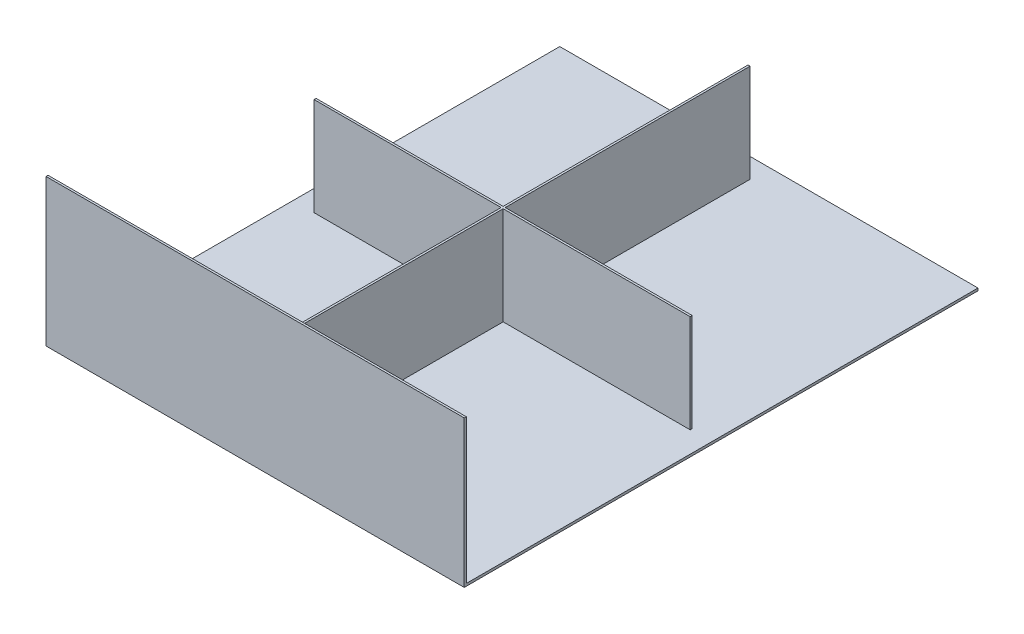
ISO-10303-21;
HEADER;
FILE_DESCRIPTION(('STEP AP214'),'2;1');
FILE_NAME('part.step','',(''),(''),'','','');
FILE_SCHEMA(('AUTOMOTIVE_DESIGN { 1 0 10303 214 1 1 1 1 }'));
ENDSEC;
DATA;
#1=APPLICATION_CONTEXT('core data for automotive mechanical design processes');
#2=APPLICATION_PROTOCOL_DEFINITION('international standard','automotive_design',2000,#1);
#3=PRODUCT_CONTEXT('',#1,'mechanical');
#4=PRODUCT('Part','Part','',(#3));
#5=PRODUCT_RELATED_PRODUCT_CATEGORY('part','',(#4));
#6=PRODUCT_DEFINITION_FORMATION('','',#4);
#7=PRODUCT_DEFINITION_CONTEXT('part definition',#1,'design');
#8=PRODUCT_DEFINITION('design','',#6,#7);
#9=PRODUCT_DEFINITION_SHAPE('','',#8);
#10=(LENGTH_UNIT() NAMED_UNIT(*) SI_UNIT(.MILLI.,.METRE.));
#11=(NAMED_UNIT(*) PLANE_ANGLE_UNIT() SI_UNIT($,.RADIAN.));
#12=(NAMED_UNIT(*) SI_UNIT($,.STERADIAN.) SOLID_ANGLE_UNIT());
#13=UNCERTAINTY_MEASURE_WITH_UNIT(LENGTH_MEASURE(1.E-05),#10,'distance_accuracy_value','');
#14=(GEOMETRIC_REPRESENTATION_CONTEXT(3) GLOBAL_UNCERTAINTY_ASSIGNED_CONTEXT((#13)) GLOBAL_UNIT_ASSIGNED_CONTEXT((#10,
#11,#12)) REPRESENTATION_CONTEXT('',''));
#15=CARTESIAN_POINT('',(0.,0.,0.));
#16=DIRECTION('',(0.,0.,1.));
#17=DIRECTION('',(1.,0.,0.));
#18=AXIS2_PLACEMENT_3D('',#15,#16,#17);
#19=CARTESIAN_POINT('',(0.,2.64,0.));
#20=DIRECTION('',(0.,1.,0.));
#21=DIRECTION('',(0.,0.,1.));
#22=AXIS2_PLACEMENT_3D('',#19,#20,#21);
#23=PLANE('',#22);
#24=DIRECTION('',(1.,0.,0.));
#25=VECTOR('',#24,1.);
#26=CARTESIAN_POINT('',(1.1,2.64,0.));
#27=LINE('',#26,#25);
#28=CARTESIAN_POINT('',(1.1,2.64,0.));
#29=VERTEX_POINT('',#28);
#30=CARTESIAN_POINT('',(202.6,2.64,0.));
#31=VERTEX_POINT('',#30);
#32=EDGE_CURVE('E52',#29,#31,#27,.T.);
#33=ORIENTED_EDGE('',*,*,#32,.F.);
#34=DIRECTION('',(0.,0.,-1.));
#35=VECTOR('',#34,1.);
#36=CARTESIAN_POINT('',(1.1,2.64,264.));
#37=LINE('',#36,#35);
#38=CARTESIAN_POINT('',(1.09999999999999,2.64,264.));
#39=VERTEX_POINT('',#38);
#40=EDGE_CURVE('E209',#39,#29,#37,.T.);
#41=ORIENTED_EDGE('',*,*,#40,.F.);
#42=DIRECTION('',(-1.,0.,0.));
#43=VECTOR('',#42,1.);
#44=CARTESIAN_POINT('',(-225.35,2.64,264.));
#45=LINE('',#44,#43);
#46=CARTESIAN_POINT('',(225.35,2.64,264.));
#47=VERTEX_POINT('',#46);
#48=EDGE_CURVE('E167',#47,#39,#45,.T.);
#49=ORIENTED_EDGE('',*,*,#48,.F.);
#50=DIRECTION('',(0.,0.,-1.));
#51=VECTOR('',#50,1.);
#52=CARTESIAN_POINT('',(225.35,2.64,266.2));
#53=LINE('',#52,#51);
#54=CARTESIAN_POINT('',(225.35,2.64,-287.45));
#55=VERTEX_POINT('',#54);
#56=EDGE_CURVE('E279',#47,#55,#53,.T.);
#57=ORIENTED_EDGE('',*,*,#56,.T.);
#58=DIRECTION('',(-1.,0.,0.));
#59=VECTOR('',#58,1.);
#60=CARTESIAN_POINT('',(225.35,2.64,-287.45));
#61=LINE('',#60,#59);
#62=CARTESIAN_POINT('',(-225.35,2.64,-287.45));
#63=VERTEX_POINT('',#62);
#64=EDGE_CURVE('E281',#55,#63,#61,.T.);
#65=ORIENTED_EDGE('',*,*,#64,.T.);
#66=DIRECTION('',(0.,0.,1.));
#67=VECTOR('',#66,1.);
#68=CARTESIAN_POINT('',(-225.35,2.64,266.2));
#69=LINE('',#68,#67);
#70=CARTESIAN_POINT('',(-225.35,2.64,264.));
#71=VERTEX_POINT('',#70);
#72=EDGE_CURVE('E284',#63,#71,#69,.T.);
#73=ORIENTED_EDGE('',*,*,#72,.T.);
#74=CARTESIAN_POINT('',(-1.09999999999999,2.64,264.));
#75=VERTEX_POINT('',#74);
#76=EDGE_CURVE('E169',#75,#71,#45,.T.);
#77=ORIENTED_EDGE('',*,*,#76,.F.);
#78=DIRECTION('',(0.,0.,1.));
#79=VECTOR('',#78,1.);
#80=CARTESIAN_POINT('',(-1.1,2.64,264.));
#81=LINE('',#80,#79);
#82=CARTESIAN_POINT('',(-1.1,2.64,0.));
#83=VERTEX_POINT('',#82);
#84=EDGE_CURVE('E184',#83,#75,#81,.T.);
#85=ORIENTED_EDGE('',*,*,#84,.F.);
#86=DIRECTION('',(1.,0.,0.));
#87=VECTOR('',#86,1.);
#88=CARTESIAN_POINT('',(-202.6,2.64,0.));
#89=LINE('',#88,#87);
#90=CARTESIAN_POINT('',(-202.6,2.64,0.));
#91=VERTEX_POINT('',#90);
#92=EDGE_CURVE('E187',#91,#83,#89,.T.);
#93=ORIENTED_EDGE('',*,*,#92,.F.);
#94=DIRECTION('',(0.,0.,1.));
#95=VECTOR('',#94,1.);
#96=CARTESIAN_POINT('',(-202.6,2.64,0.));
#97=LINE('',#96,#95);
#98=CARTESIAN_POINT('',(-202.6,2.64,-2.19999999999999));
#99=VERTEX_POINT('',#98);
#100=EDGE_CURVE('E228',#99,#91,#97,.T.);
#101=ORIENTED_EDGE('',*,*,#100,.F.);
#102=DIRECTION('',(-1.,0.,0.));
#103=VECTOR('',#102,1.);
#104=CARTESIAN_POINT('',(-202.6,2.64,-2.19999999999999));
#105=LINE('',#104,#103);
#106=CARTESIAN_POINT('',(-1.1,2.64,-2.19999999999999));
#107=VERTEX_POINT('',#106);
#108=EDGE_CURVE('E225',#107,#99,#105,.T.);
#109=ORIENTED_EDGE('',*,*,#108,.F.);
#110=DIRECTION('',(0.,0.,1.));
#111=VECTOR('',#110,1.);
#112=CARTESIAN_POINT('',(-1.1,2.64,-2.19999999999999));
#113=LINE('',#112,#111);
#114=CARTESIAN_POINT('',(-1.1,2.64,-266.2));
#115=VERTEX_POINT('',#114);
#116=EDGE_CURVE('E222',#115,#107,#113,.T.);
#117=ORIENTED_EDGE('',*,*,#116,.F.);
#118=DIRECTION('',(-1.,0.,0.));
#119=VECTOR('',#118,1.);
#120=CARTESIAN_POINT('',(1.1,2.64,-266.2));
#121=LINE('',#120,#119);
#122=CARTESIAN_POINT('',(1.1,2.64,-266.2));
#123=VERTEX_POINT('',#122);
#124=EDGE_CURVE('E219',#123,#115,#121,.T.);
#125=ORIENTED_EDGE('',*,*,#124,.F.);
#126=DIRECTION('',(0.,0.,-1.));
#127=VECTOR('',#126,1.);
#128=CARTESIAN_POINT('',(1.1,2.64,-2.19999999999999));
#129=LINE('',#128,#127);
#130=CARTESIAN_POINT('',(1.1,2.64,-2.19999999999999));
#131=VERTEX_POINT('',#130);
#132=EDGE_CURVE('E216',#131,#123,#129,.T.);
#133=ORIENTED_EDGE('',*,*,#132,.F.);
#134=DIRECTION('',(-1.,0.,0.));
#135=VECTOR('',#134,1.);
#136=CARTESIAN_POINT('',(1.1,2.64,-2.19999999999999));
#137=LINE('',#136,#135);
#138=CARTESIAN_POINT('',(202.6,2.64,-2.19999999999999));
#139=VERTEX_POINT('',#138);
#140=EDGE_CURVE('E213',#139,#131,#137,.T.);
#141=ORIENTED_EDGE('',*,*,#140,.F.);
#142=DIRECTION('',(0.,0.,-1.));
#143=VECTOR('',#142,1.);
#144=CARTESIAN_POINT('',(202.6,2.64,0.));
#145=LINE('',#144,#143);
#146=EDGE_CURVE('E57',#31,#139,#145,.T.);
#147=ORIENTED_EDGE('',*,*,#146,.F.);
#148=EDGE_LOOP('',(#33,#41,#49,#57,#65,#73,#77,#85,#93,#101,#109,#117,#125,#133,#141,#147));
#149=FACE_BOUND('',#148,.T.);
#150=ADVANCED_FACE('F37',(#149),#23,.T.);
#151=CARTESIAN_POINT('',(-225.35,158.24,264.));
#152=DIRECTION('',(0.,0.,1.));
#153=DIRECTION('',(1.,0.,0.));
#154=AXIS2_PLACEMENT_3D('',#151,#152,#153);
#155=PLANE('',#154);
#156=DIRECTION('',(0.,-1.,0.));
#157=VECTOR('',#156,1.);
#158=CARTESIAN_POINT('',(1.1,108.24,264.));
#159=LINE('',#158,#157);
#160=CARTESIAN_POINT('',(1.1,108.24,264.));
#161=VERTEX_POINT('',#160);
#162=EDGE_CURVE('E160',#161,#39,#159,.T.);
#163=ORIENTED_EDGE('',*,*,#162,.F.);
#164=DIRECTION('',(1.,0.,0.));
#165=VECTOR('',#164,1.);
#166=CARTESIAN_POINT('',(1.1,108.24,264.));
#167=LINE('',#166,#165);
#168=CARTESIAN_POINT('',(-1.09999999999999,108.24,264.));
#169=VERTEX_POINT('',#168);
#170=EDGE_CURVE('E164',#169,#161,#167,.T.);
#171=ORIENTED_EDGE('',*,*,#170,.F.);
#172=DIRECTION('',(0.,-1.,0.));
#173=VECTOR('',#172,1.);
#174=CARTESIAN_POINT('',(-1.1,108.24,264.));
#175=LINE('',#174,#173);
#176=EDGE_CURVE('E208',#169,#75,#175,.T.);
#177=ORIENTED_EDGE('',*,*,#176,.T.);
#178=ORIENTED_EDGE('',*,*,#76,.T.);
#179=DIRECTION('',(0.,-1.,0.));
#180=VECTOR('',#179,1.);
#181=CARTESIAN_POINT('',(-225.35,158.24,264.));
#182=LINE('',#181,#180);
#183=CARTESIAN_POINT('',(-225.35,158.24,264.));
#184=VERTEX_POINT('',#183);
#185=EDGE_CURVE('E272',#184,#71,#182,.T.);
#186=ORIENTED_EDGE('',*,*,#185,.F.);
#187=DIRECTION('',(-1.,0.,0.));
#188=VECTOR('',#187,1.);
#189=CARTESIAN_POINT('',(-225.35,158.24,264.));
#190=LINE('',#189,#188);
#191=CARTESIAN_POINT('',(225.35,158.24,264.));
#192=VERTEX_POINT('',#191);
#193=EDGE_CURVE('E270',#192,#184,#190,.T.);
#194=ORIENTED_EDGE('',*,*,#193,.F.);
#195=DIRECTION('',(0.,-1.,0.));
#196=VECTOR('',#195,1.);
#197=CARTESIAN_POINT('',(225.35,158.24,264.));
#198=LINE('',#197,#196);
#199=EDGE_CURVE('E276',#192,#47,#198,.T.);
#200=ORIENTED_EDGE('',*,*,#199,.T.);
#201=ORIENTED_EDGE('',*,*,#48,.T.);
#202=EDGE_LOOP('',(#163,#171,#177,#178,#186,#194,#200,#201));
#203=FACE_BOUND('',#202,.T.);
#204=ADVANCED_FACE('F162',(#203),#155,.F.);
#205=CARTESIAN_POINT('',(225.35,2.64,266.2));
#206=DIRECTION('',(-1.,0.,0.));
#207=DIRECTION('',(0.,0.,1.));
#208=AXIS2_PLACEMENT_3D('',#205,#206,#207);
#209=PLANE('',#208);
#210=DIRECTION('',(0.,0.,-1.));
#211=VECTOR('',#210,1.);
#212=CARTESIAN_POINT('',(225.35,0.,266.2));
#213=LINE('',#212,#211);
#214=CARTESIAN_POINT('',(225.35,0.,266.2));
#215=VERTEX_POINT('',#214);
#216=CARTESIAN_POINT('',(225.35,0.,-287.45));
#217=VERTEX_POINT('',#216);
#218=EDGE_CURVE('E278',#215,#217,#213,.T.);
#219=ORIENTED_EDGE('',*,*,#218,.T.);
#220=DIRECTION('',(0.,-1.,0.));
#221=VECTOR('',#220,1.);
#222=CARTESIAN_POINT('',(225.35,2.64,-287.45));
#223=LINE('',#222,#221);
#224=EDGE_CURVE('E45',#55,#217,#223,.T.);
#225=ORIENTED_EDGE('',*,*,#224,.F.);
#226=ORIENTED_EDGE('',*,*,#56,.F.);
#227=ORIENTED_EDGE('',*,*,#199,.F.);
#228=DIRECTION('',(0.,0.,-1.));
#229=VECTOR('',#228,1.);
#230=CARTESIAN_POINT('',(225.35,158.24,266.2));
#231=LINE('',#230,#229);
#232=CARTESIAN_POINT('',(225.35,158.24,266.2));
#233=VERTEX_POINT('',#232);
#234=EDGE_CURVE('E268',#233,#192,#231,.T.);
#235=ORIENTED_EDGE('',*,*,#234,.F.);
#236=DIRECTION('',(0.,-1.,0.));
#237=VECTOR('',#236,1.);
#238=CARTESIAN_POINT('',(225.35,2.64,266.2));
#239=LINE('',#238,#237);
#240=EDGE_CURVE('E11',#233,#215,#239,.T.);
#241=ORIENTED_EDGE('',*,*,#240,.T.);
#242=EDGE_LOOP('',(#219,#225,#226,#227,#235,#241));
#243=FACE_BOUND('',#242,.T.);
#244=ADVANCED_FACE('F39',(#243),#209,.F.);
#245=CARTESIAN_POINT('',(225.35,2.64,-287.45));
#246=DIRECTION('',(0.,0.,1.));
#247=DIRECTION('',(1.,0.,0.));
#248=AXIS2_PLACEMENT_3D('',#245,#246,#247);
#249=PLANE('',#248);
#250=DIRECTION('',(-1.,0.,0.));
#251=VECTOR('',#250,1.);
#252=CARTESIAN_POINT('',(225.35,0.,-287.45));
#253=LINE('',#252,#251);
#254=CARTESIAN_POINT('',(-225.35,0.,-287.45));
#255=VERTEX_POINT('',#254);
#256=EDGE_CURVE('E289',#217,#255,#253,.T.);
#257=ORIENTED_EDGE('',*,*,#256,.T.);
#258=DIRECTION('',(0.,-1.,0.));
#259=VECTOR('',#258,1.);
#260=CARTESIAN_POINT('',(-225.35,2.64,-287.45));
#261=LINE('',#260,#259);
#262=EDGE_CURVE('E297',#63,#255,#261,.T.);
#263=ORIENTED_EDGE('',*,*,#262,.F.);
#264=ORIENTED_EDGE('',*,*,#64,.F.);
#265=ORIENTED_EDGE('',*,*,#224,.T.);
#266=EDGE_LOOP('',(#257,#263,#264,#265));
#267=FACE_BOUND('',#266,.T.);
#268=ADVANCED_FACE('F304',(#267),#249,.F.);
#269=CARTESIAN_POINT('',(-225.35,2.64,266.2));
#270=DIRECTION('',(1.,0.,0.));
#271=DIRECTION('',(0.,0.,-1.));
#272=AXIS2_PLACEMENT_3D('',#269,#270,#271);
#273=PLANE('',#272);
#274=DIRECTION('',(0.,0.,1.));
#275=VECTOR('',#274,1.);
#276=CARTESIAN_POINT('',(-225.35,0.,266.2));
#277=LINE('',#276,#275);
#278=CARTESIAN_POINT('',(-225.35,0.,266.2));
#279=VERTEX_POINT('',#278);
#280=EDGE_CURVE('E291',#255,#279,#277,.T.);
#281=ORIENTED_EDGE('',*,*,#280,.T.);
#282=DIRECTION('',(0.,-1.,0.));
#283=VECTOR('',#282,1.);
#284=CARTESIAN_POINT('',(-225.35,2.64,266.2));
#285=LINE('',#284,#283);
#286=CARTESIAN_POINT('',(-225.35,158.24,266.2));
#287=VERTEX_POINT('',#286);
#288=EDGE_CURVE('E287',#287,#279,#285,.T.);
#289=ORIENTED_EDGE('',*,*,#288,.F.);
#290=DIRECTION('',(0.,0.,1.));
#291=VECTOR('',#290,1.);
#292=CARTESIAN_POINT('',(-225.35,158.24,266.2));
#293=LINE('',#292,#291);
#294=EDGE_CURVE('E262',#184,#287,#293,.T.);
#295=ORIENTED_EDGE('',*,*,#294,.F.);
#296=ORIENTED_EDGE('',*,*,#185,.T.);
#297=ORIENTED_EDGE('',*,*,#72,.F.);
#298=ORIENTED_EDGE('',*,*,#262,.T.);
#299=EDGE_LOOP('',(#281,#289,#295,#296,#297,#298));
#300=FACE_BOUND('',#299,.T.);
#301=ADVANCED_FACE('F313',(#300),#273,.F.);
#302=CARTESIAN_POINT('',(204.1,2.64,266.2));
#303=DIRECTION('',(0.,0.,-1.));
#304=DIRECTION('',(-1.,0.,0.));
#305=AXIS2_PLACEMENT_3D('',#302,#303,#304);
#306=PLANE('',#305);
#307=DIRECTION('',(1.,0.,0.));
#308=VECTOR('',#307,1.);
#309=CARTESIAN_POINT('',(204.1,0.,266.2));
#310=LINE('',#309,#308);
#311=EDGE_CURVE('E282',#279,#215,#310,.T.);
#312=ORIENTED_EDGE('',*,*,#311,.T.);
#313=ORIENTED_EDGE('',*,*,#240,.F.);
#314=DIRECTION('',(1.,0.,0.));
#315=VECTOR('',#314,1.);
#316=CARTESIAN_POINT('',(-225.35,158.24,266.2));
#317=LINE('',#316,#315);
#318=EDGE_CURVE('E265',#287,#233,#317,.T.);
#319=ORIENTED_EDGE('',*,*,#318,.F.);
#320=ORIENTED_EDGE('',*,*,#288,.T.);
#321=EDGE_LOOP('',(#312,#313,#319,#320));
#322=FACE_BOUND('',#321,.T.);
#323=ADVANCED_FACE('F318',(#322),#306,.F.);
#324=CARTESIAN_POINT('',(0.,0.,0.));
#325=DIRECTION('',(0.,1.,0.));
#326=DIRECTION('',(0.,0.,1.));
#327=AXIS2_PLACEMENT_3D('',#324,#325,#326);
#328=PLANE('',#327);
#329=ORIENTED_EDGE('',*,*,#218,.F.);
#330=ORIENTED_EDGE('',*,*,#311,.F.);
#331=ORIENTED_EDGE('',*,*,#280,.F.);
#332=ORIENTED_EDGE('',*,*,#256,.F.);
#333=EDGE_LOOP('',(#329,#330,#331,#332));
#334=FACE_BOUND('',#333,.T.);
#335=ADVANCED_FACE('F311',(#334),#328,.F.);
#336=CARTESIAN_POINT('',(0.,158.24,0.));
#337=DIRECTION('',(0.,-1.,0.));
#338=DIRECTION('',(0.,0.,-1.));
#339=AXIS2_PLACEMENT_3D('',#336,#337,#338);
#340=PLANE('',#339);
#341=ORIENTED_EDGE('',*,*,#294,.T.);
#342=ORIENTED_EDGE('',*,*,#318,.T.);
#343=ORIENTED_EDGE('',*,*,#234,.T.);
#344=ORIENTED_EDGE('',*,*,#193,.T.);
#345=EDGE_LOOP('',(#341,#342,#343,#344));
#346=FACE_BOUND('',#345,.T.);
#347=ADVANCED_FACE('F321',(#346),#340,.F.);
#348=CARTESIAN_POINT('',(1.1,108.24,264.));
#349=DIRECTION('',(-1.,0.,0.));
#350=DIRECTION('',(0.,0.,1.));
#351=AXIS2_PLACEMENT_3D('',#348,#349,#350);
#352=PLANE('',#351);
#353=ORIENTED_EDGE('',*,*,#40,.T.);
#354=DIRECTION('',(0.,-1.,0.));
#355=VECTOR('',#354,1.);
#356=CARTESIAN_POINT('',(1.1,108.24,0.));
#357=LINE('',#356,#355);
#358=CARTESIAN_POINT('',(1.1,108.24,0.));
#359=VERTEX_POINT('',#358);
#360=EDGE_CURVE('E170',#359,#29,#357,.T.);
#361=ORIENTED_EDGE('',*,*,#360,.F.);
#362=DIRECTION('',(0.,0.,-1.));
#363=VECTOR('',#362,1.);
#364=CARTESIAN_POINT('',(1.1,108.24,264.));
#365=LINE('',#364,#363);
#366=EDGE_CURVE('E173',#161,#359,#365,.T.);
#367=ORIENTED_EDGE('',*,*,#366,.F.);
#368=ORIENTED_EDGE('',*,*,#162,.T.);
#369=EDGE_LOOP('',(#353,#361,#367,#368));
#370=FACE_BOUND('',#369,.T.);
#371=ADVANCED_FACE('F174',(#370),#352,.F.);
#372=CARTESIAN_POINT('',(1.1,108.24,0.));
#373=DIRECTION('',(0.,0.,-1.));
#374=DIRECTION('',(-1.,0.,0.));
#375=AXIS2_PLACEMENT_3D('',#372,#373,#374);
#376=PLANE('',#375);
#377=ORIENTED_EDGE('',*,*,#32,.T.);
#378=DIRECTION('',(0.,-1.,0.));
#379=VECTOR('',#378,1.);
#380=CARTESIAN_POINT('',(202.6,108.24,0.));
#381=LINE('',#380,#379);
#382=CARTESIAN_POINT('',(202.6,108.24,0.));
#383=VERTEX_POINT('',#382);
#384=EDGE_CURVE('E258',#383,#31,#381,.T.);
#385=ORIENTED_EDGE('',*,*,#384,.F.);
#386=DIRECTION('',(1.,0.,0.));
#387=VECTOR('',#386,1.);
#388=CARTESIAN_POINT('',(1.1,108.24,0.));
#389=LINE('',#388,#387);
#390=EDGE_CURVE('E178',#359,#383,#389,.T.);
#391=ORIENTED_EDGE('',*,*,#390,.F.);
#392=ORIENTED_EDGE('',*,*,#360,.T.);
#393=EDGE_LOOP('',(#377,#385,#391,#392));
#394=FACE_BOUND('',#393,.T.);
#395=ADVANCED_FACE('F366',(#394),#376,.F.);
#396=CARTESIAN_POINT('',(202.6,108.24,0.));
#397=DIRECTION('',(-1.,0.,0.));
#398=DIRECTION('',(0.,0.,1.));
#399=AXIS2_PLACEMENT_3D('',#396,#397,#398);
#400=PLANE('',#399);
#401=ORIENTED_EDGE('',*,*,#146,.T.);
#402=DIRECTION('',(0.,-1.,0.));
#403=VECTOR('',#402,1.);
#404=CARTESIAN_POINT('',(202.6,108.24,-2.19999999999999));
#405=LINE('',#404,#403);
#406=CARTESIAN_POINT('',(202.6,108.24,-2.19999999999999));
#407=VERTEX_POINT('',#406);
#408=EDGE_CURVE('E255',#407,#139,#405,.T.);
#409=ORIENTED_EDGE('',*,*,#408,.F.);
#410=DIRECTION('',(0.,0.,-1.));
#411=VECTOR('',#410,1.);
#412=CARTESIAN_POINT('',(202.6,108.24,0.));
#413=LINE('',#412,#411);
#414=EDGE_CURVE('E191',#383,#407,#413,.T.);
#415=ORIENTED_EDGE('',*,*,#414,.F.);
#416=ORIENTED_EDGE('',*,*,#384,.T.);
#417=EDGE_LOOP('',(#401,#409,#415,#416));
#418=FACE_BOUND('',#417,.T.);
#419=ADVANCED_FACE('F374',(#418),#400,.F.);
#420=CARTESIAN_POINT('',(1.1,108.24,-2.19999999999999));
#421=DIRECTION('',(0.,0.,1.));
#422=DIRECTION('',(1.,0.,0.));
#423=AXIS2_PLACEMENT_3D('',#420,#421,#422);
#424=PLANE('',#423);
#425=ORIENTED_EDGE('',*,*,#140,.T.);
#426=DIRECTION('',(0.,-1.,0.));
#427=VECTOR('',#426,1.);
#428=CARTESIAN_POINT('',(1.1,108.24,-2.19999999999999));
#429=LINE('',#428,#427);
#430=CARTESIAN_POINT('',(1.1,108.24,-2.19999999999999));
#431=VERTEX_POINT('',#430);
#432=EDGE_CURVE('E252',#431,#131,#429,.T.);
#433=ORIENTED_EDGE('',*,*,#432,.F.);
#434=DIRECTION('',(-1.,0.,0.));
#435=VECTOR('',#434,1.);
#436=CARTESIAN_POINT('',(1.1,108.24,-2.19999999999999));
#437=LINE('',#436,#435);
#438=EDGE_CURVE('E193',#407,#431,#437,.T.);
#439=ORIENTED_EDGE('',*,*,#438,.F.);
#440=ORIENTED_EDGE('',*,*,#408,.T.);
#441=EDGE_LOOP('',(#425,#433,#439,#440));
#442=FACE_BOUND('',#441,.T.);
#443=ADVANCED_FACE('F382',(#442),#424,.F.);
#444=CARTESIAN_POINT('',(1.1,108.24,-2.19999999999999));
#445=DIRECTION('',(-1.,0.,0.));
#446=DIRECTION('',(0.,0.,1.));
#447=AXIS2_PLACEMENT_3D('',#444,#445,#446);
#448=PLANE('',#447);
#449=ORIENTED_EDGE('',*,*,#132,.T.);
#450=DIRECTION('',(0.,-1.,0.));
#451=VECTOR('',#450,1.);
#452=CARTESIAN_POINT('',(1.1,108.24,-266.2));
#453=LINE('',#452,#451);
#454=CARTESIAN_POINT('',(1.1,108.24,-266.2));
#455=VERTEX_POINT('',#454);
#456=EDGE_CURVE('E249',#455,#123,#453,.T.);
#457=ORIENTED_EDGE('',*,*,#456,.F.);
#458=DIRECTION('',(0.,0.,-1.));
#459=VECTOR('',#458,1.);
#460=CARTESIAN_POINT('',(1.1,108.24,-2.19999999999999));
#461=LINE('',#460,#459);
#462=EDGE_CURVE('E195',#431,#455,#461,.T.);
#463=ORIENTED_EDGE('',*,*,#462,.F.);
#464=ORIENTED_EDGE('',*,*,#432,.T.);
#465=EDGE_LOOP('',(#449,#457,#463,#464));
#466=FACE_BOUND('',#465,.T.);
#467=ADVANCED_FACE('F390',(#466),#448,.F.);
#468=CARTESIAN_POINT('',(1.1,108.24,-266.2));
#469=DIRECTION('',(0.,0.,1.));
#470=DIRECTION('',(1.,0.,0.));
#471=AXIS2_PLACEMENT_3D('',#468,#469,#470);
#472=PLANE('',#471);
#473=ORIENTED_EDGE('',*,*,#124,.T.);
#474=DIRECTION('',(0.,-1.,0.));
#475=VECTOR('',#474,1.);
#476=CARTESIAN_POINT('',(-1.1,108.24,-266.2));
#477=LINE('',#476,#475);
#478=CARTESIAN_POINT('',(-1.1,108.24,-266.2));
#479=VERTEX_POINT('',#478);
#480=EDGE_CURVE('E246',#479,#115,#477,.T.);
#481=ORIENTED_EDGE('',*,*,#480,.F.);
#482=DIRECTION('',(-1.,0.,0.));
#483=VECTOR('',#482,1.);
#484=CARTESIAN_POINT('',(1.1,108.24,-266.2));
#485=LINE('',#484,#483);
#486=EDGE_CURVE('E197',#455,#479,#485,.T.);
#487=ORIENTED_EDGE('',*,*,#486,.F.);
#488=ORIENTED_EDGE('',*,*,#456,.T.);
#489=EDGE_LOOP('',(#473,#481,#487,#488));
#490=FACE_BOUND('',#489,.T.);
#491=ADVANCED_FACE('F398',(#490),#472,.F.);
#492=CARTESIAN_POINT('',(-1.1,108.24,-2.19999999999999));
#493=DIRECTION('',(1.,0.,0.));
#494=DIRECTION('',(0.,0.,-1.));
#495=AXIS2_PLACEMENT_3D('',#492,#493,#494);
#496=PLANE('',#495);
#497=ORIENTED_EDGE('',*,*,#116,.T.);
#498=DIRECTION('',(0.,-1.,0.));
#499=VECTOR('',#498,1.);
#500=CARTESIAN_POINT('',(-1.1,108.24,-2.19999999999999));
#501=LINE('',#500,#499);
#502=CARTESIAN_POINT('',(-1.1,108.24,-2.19999999999999));
#503=VERTEX_POINT('',#502);
#504=EDGE_CURVE('E243',#503,#107,#501,.T.);
#505=ORIENTED_EDGE('',*,*,#504,.F.);
#506=DIRECTION('',(0.,0.,1.));
#507=VECTOR('',#506,1.);
#508=CARTESIAN_POINT('',(-1.1,108.24,-2.19999999999999));
#509=LINE('',#508,#507);
#510=EDGE_CURVE('E199',#479,#503,#509,.T.);
#511=ORIENTED_EDGE('',*,*,#510,.F.);
#512=ORIENTED_EDGE('',*,*,#480,.T.);
#513=EDGE_LOOP('',(#497,#505,#511,#512));
#514=FACE_BOUND('',#513,.T.);
#515=ADVANCED_FACE('F406',(#514),#496,.F.);
#516=CARTESIAN_POINT('',(-202.6,108.24,-2.19999999999999));
#517=DIRECTION('',(0.,0.,1.));
#518=DIRECTION('',(1.,0.,0.));
#519=AXIS2_PLACEMENT_3D('',#516,#517,#518);
#520=PLANE('',#519);
#521=ORIENTED_EDGE('',*,*,#108,.T.);
#522=DIRECTION('',(0.,-1.,0.));
#523=VECTOR('',#522,1.);
#524=CARTESIAN_POINT('',(-202.6,108.24,-2.19999999999999));
#525=LINE('',#524,#523);
#526=CARTESIAN_POINT('',(-202.6,108.24,-2.19999999999999));
#527=VERTEX_POINT('',#526);
#528=EDGE_CURVE('E240',#527,#99,#525,.T.);
#529=ORIENTED_EDGE('',*,*,#528,.F.);
#530=DIRECTION('',(-1.,0.,0.));
#531=VECTOR('',#530,1.);
#532=CARTESIAN_POINT('',(-202.6,108.24,-2.19999999999999));
#533=LINE('',#532,#531);
#534=EDGE_CURVE('E201',#503,#527,#533,.T.);
#535=ORIENTED_EDGE('',*,*,#534,.F.);
#536=ORIENTED_EDGE('',*,*,#504,.T.);
#537=EDGE_LOOP('',(#521,#529,#535,#536));
#538=FACE_BOUND('',#537,.T.);
#539=ADVANCED_FACE('F414',(#538),#520,.F.);
#540=CARTESIAN_POINT('',(-202.6,108.24,0.));
#541=DIRECTION('',(1.,0.,0.));
#542=DIRECTION('',(0.,0.,-1.));
#543=AXIS2_PLACEMENT_3D('',#540,#541,#542);
#544=PLANE('',#543);
#545=ORIENTED_EDGE('',*,*,#100,.T.);
#546=DIRECTION('',(0.,-1.,0.));
#547=VECTOR('',#546,1.);
#548=CARTESIAN_POINT('',(-202.6,108.24,0.));
#549=LINE('',#548,#547);
#550=CARTESIAN_POINT('',(-202.6,108.24,0.));
#551=VERTEX_POINT('',#550);
#552=EDGE_CURVE('E237',#551,#91,#549,.T.);
#553=ORIENTED_EDGE('',*,*,#552,.F.);
#554=DIRECTION('',(0.,0.,1.));
#555=VECTOR('',#554,1.);
#556=CARTESIAN_POINT('',(-202.6,108.24,0.));
#557=LINE('',#556,#555);
#558=EDGE_CURVE('E203',#527,#551,#557,.T.);
#559=ORIENTED_EDGE('',*,*,#558,.F.);
#560=ORIENTED_EDGE('',*,*,#528,.T.);
#561=EDGE_LOOP('',(#545,#553,#559,#560));
#562=FACE_BOUND('',#561,.T.);
#563=ADVANCED_FACE('F422',(#562),#544,.F.);
#564=CARTESIAN_POINT('',(-202.6,108.24,0.));
#565=DIRECTION('',(0.,0.,-1.));
#566=DIRECTION('',(-1.,0.,0.));
#567=AXIS2_PLACEMENT_3D('',#564,#565,#566);
#568=PLANE('',#567);
#569=ORIENTED_EDGE('',*,*,#92,.T.);
#570=DIRECTION('',(0.,-1.,0.));
#571=VECTOR('',#570,1.);
#572=CARTESIAN_POINT('',(-1.1,108.24,0.));
#573=LINE('',#572,#571);
#574=CARTESIAN_POINT('',(-1.1,108.24,0.));
#575=VERTEX_POINT('',#574);
#576=EDGE_CURVE('E234',#575,#83,#573,.T.);
#577=ORIENTED_EDGE('',*,*,#576,.F.);
#578=DIRECTION('',(1.,0.,0.));
#579=VECTOR('',#578,1.);
#580=CARTESIAN_POINT('',(-202.6,108.24,0.));
#581=LINE('',#580,#579);
#582=EDGE_CURVE('E205',#551,#575,#581,.T.);
#583=ORIENTED_EDGE('',*,*,#582,.F.);
#584=ORIENTED_EDGE('',*,*,#552,.T.);
#585=EDGE_LOOP('',(#569,#577,#583,#584));
#586=FACE_BOUND('',#585,.T.);
#587=ADVANCED_FACE('F430',(#586),#568,.F.);
#588=CARTESIAN_POINT('',(-1.1,108.24,264.));
#589=DIRECTION('',(1.,0.,0.));
#590=DIRECTION('',(0.,0.,-1.));
#591=AXIS2_PLACEMENT_3D('',#588,#589,#590);
#592=PLANE('',#591);
#593=ORIENTED_EDGE('',*,*,#84,.T.);
#594=ORIENTED_EDGE('',*,*,#176,.F.);
#595=DIRECTION('',(0.,0.,1.));
#596=VECTOR('',#595,1.);
#597=CARTESIAN_POINT('',(-1.1,108.24,264.));
#598=LINE('',#597,#596);
#599=EDGE_CURVE('E182',#575,#169,#598,.T.);
#600=ORIENTED_EDGE('',*,*,#599,.F.);
#601=ORIENTED_EDGE('',*,*,#576,.T.);
#602=EDGE_LOOP('',(#593,#594,#600,#601));
#603=FACE_BOUND('',#602,.T.);
#604=ADVANCED_FACE('F438',(#603),#592,.F.);
#605=CARTESIAN_POINT('',(0.,108.24,0.));
#606=DIRECTION('',(0.,-1.,0.));
#607=DIRECTION('',(0.,0.,-1.));
#608=AXIS2_PLACEMENT_3D('',#605,#606,#607);
#609=PLANE('',#608);
#610=ORIENTED_EDGE('',*,*,#170,.T.);
#611=ORIENTED_EDGE('',*,*,#366,.T.);
#612=ORIENTED_EDGE('',*,*,#390,.T.);
#613=ORIENTED_EDGE('',*,*,#414,.T.);
#614=ORIENTED_EDGE('',*,*,#438,.T.);
#615=ORIENTED_EDGE('',*,*,#462,.T.);
#616=ORIENTED_EDGE('',*,*,#486,.T.);
#617=ORIENTED_EDGE('',*,*,#510,.T.);
#618=ORIENTED_EDGE('',*,*,#534,.T.);
#619=ORIENTED_EDGE('',*,*,#558,.T.);
#620=ORIENTED_EDGE('',*,*,#582,.T.);
#621=ORIENTED_EDGE('',*,*,#599,.T.);
#622=EDGE_LOOP('',(#610,#611,#612,#613,#614,#615,#616,#617,#618,#619,#620,#621));
#623=FACE_BOUND('',#622,.T.);
#624=ADVANCED_FACE('F180',(#623),#609,.F.);
#625=CLOSED_SHELL('',(#150,#204,#244,#268,#301,#323,#335,#347,#371,#395,#419,#443,#467,#491,
#515,#539,#563,#587,#604,#624));
#626=MANIFOLD_SOLID_BREP('B2',#625);
#627=ADVANCED_BREP_SHAPE_REPRESENTATION('',(#18,#626),#14);
#628=SHAPE_DEFINITION_REPRESENTATION(#9,#627);
ENDSEC;
END-ISO-10303-21;
